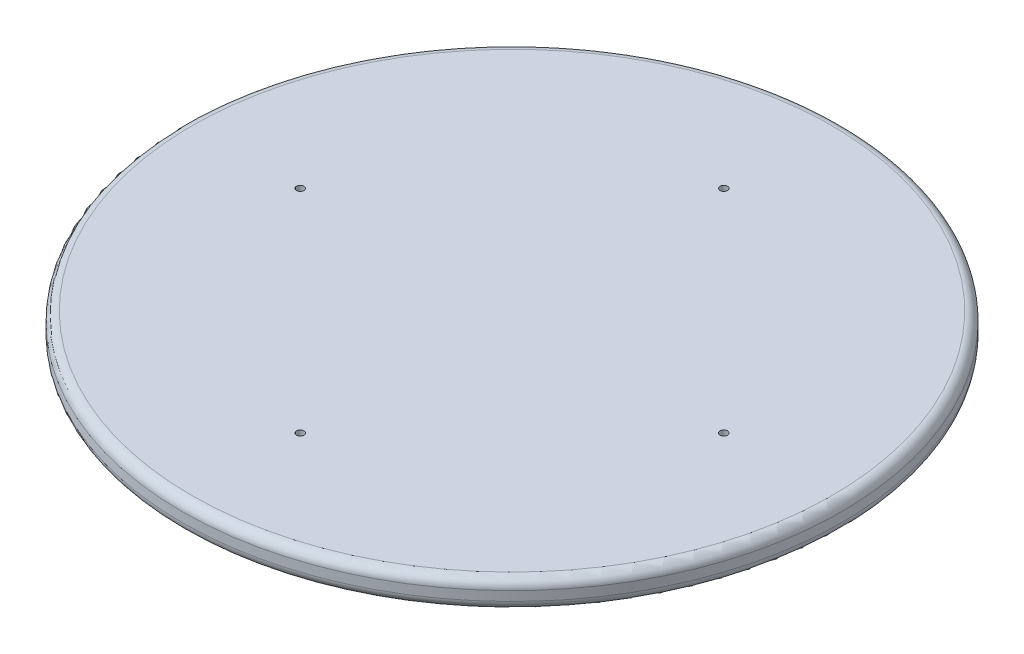
ISO-10303-21;
HEADER;
FILE_DESCRIPTION(('STEP AP214'),'2;1');
FILE_NAME('part.step','',(''),(''),'','','');
FILE_SCHEMA(('AUTOMOTIVE_DESIGN { 1 0 10303 214 1 1 1 1 }'));
ENDSEC;
DATA;
#1=APPLICATION_CONTEXT('core data for automotive mechanical design processes');
#2=APPLICATION_PROTOCOL_DEFINITION('international standard','automotive_design',2000,#1);
#3=PRODUCT_CONTEXT('',#1,'mechanical');
#4=PRODUCT('Part','Part','',(#3));
#5=PRODUCT_RELATED_PRODUCT_CATEGORY('part','',(#4));
#6=PRODUCT_DEFINITION_FORMATION('','',#4);
#7=PRODUCT_DEFINITION_CONTEXT('part definition',#1,'design');
#8=PRODUCT_DEFINITION('design','',#6,#7);
#9=PRODUCT_DEFINITION_SHAPE('','',#8);
#10=(LENGTH_UNIT() NAMED_UNIT(*) SI_UNIT(.MILLI.,.METRE.));
#11=(NAMED_UNIT(*) PLANE_ANGLE_UNIT() SI_UNIT($,.RADIAN.));
#12=(NAMED_UNIT(*) SI_UNIT($,.STERADIAN.) SOLID_ANGLE_UNIT());
#13=UNCERTAINTY_MEASURE_WITH_UNIT(LENGTH_MEASURE(1.E-05),#10,'distance_accuracy_value','');
#14=(GEOMETRIC_REPRESENTATION_CONTEXT(3) GLOBAL_UNCERTAINTY_ASSIGNED_CONTEXT((#13)) GLOBAL_UNIT_ASSIGNED_CONTEXT((#10,
#11,#12)) REPRESENTATION_CONTEXT('',''));
#15=CARTESIAN_POINT('',(0.,0.,0.));
#16=DIRECTION('',(0.,0.,1.));
#17=DIRECTION('',(1.,0.,0.));
#18=AXIS2_PLACEMENT_3D('',#15,#16,#17);
#19=CARTESIAN_POINT('',(0.,30.,0.));
#20=DIRECTION('',(0.,-1.,0.));
#21=DIRECTION('',(0.,0.,-1.));
#22=AXIS2_PLACEMENT_3D('',#19,#20,#21);
#23=CYLINDRICAL_SURFACE('',#22,350.);
#24=CARTESIAN_POINT('',(0.,10.,0.));
#25=DIRECTION('',(0.,1.,0.));
#26=DIRECTION('',(0.,0.,1.));
#27=AXIS2_PLACEMENT_3D('',#24,#25,#26);
#28=CIRCLE('',#27,350.);
#29=CARTESIAN_POINT('',(0.,10.,350.));
#30=VERTEX_POINT('',#29);
#31=EDGE_CURVE('E56',#30,#30,#28,.T.);
#32=ORIENTED_EDGE('',*,*,#31,.T.);
#33=EDGE_LOOP('',(#32));
#34=FACE_BOUND('',#33,.T.);
#35=CARTESIAN_POINT('',(0.,20.,0.));
#36=DIRECTION('',(0.,1.,0.));
#37=DIRECTION('',(0.,0.,1.));
#38=AXIS2_PLACEMENT_3D('',#35,#36,#37);
#39=CIRCLE('',#38,350.);
#40=CARTESIAN_POINT('',(0.,20.,350.));
#41=VERTEX_POINT('',#40);
#42=EDGE_CURVE('E83',#41,#41,#39,.F.);
#43=ORIENTED_EDGE('',*,*,#42,.T.);
#44=EDGE_LOOP('',(#43));
#45=FACE_BOUND('',#44,.T.);
#46=ADVANCED_FACE('F43',(#34,#45),#23,.T.);
#47=CARTESIAN_POINT('',(0.,30.,0.));
#48=DIRECTION('',(0.,1.,0.));
#49=DIRECTION('',(0.,0.,1.));
#50=AXIS2_PLACEMENT_3D('',#47,#48,#49);
#51=PLANE('',#50);
#52=CARTESIAN_POINT('',(0.,30.,-225.));
#53=DIRECTION('',(0.,1.,0.));
#54=DIRECTION('',(0.,0.,1.));
#55=AXIS2_PLACEMENT_3D('',#52,#53,#54);
#56=CIRCLE('',#55,4.);
#57=CARTESIAN_POINT('',(0.,30.,-221.));
#58=VERTEX_POINT('',#57);
#59=EDGE_CURVE('E80',#58,#58,#56,.T.);
#60=ORIENTED_EDGE('',*,*,#59,.F.);
#61=EDGE_LOOP('',(#60));
#62=FACE_BOUND('',#61,.T.);
#63=CARTESIAN_POINT('',(225.,30.,7.85583301239705E-13));
#64=DIRECTION('',(0.,1.,0.));
#65=DIRECTION('',(0.,0.,1.));
#66=AXIS2_PLACEMENT_3D('',#63,#64,#65);
#67=CIRCLE('',#66,4.00000000000001);
#68=CARTESIAN_POINT('',(225.,30.,4.00000000000079));
#69=VERTEX_POINT('',#68);
#70=EDGE_CURVE('E69',#69,#69,#67,.T.);
#71=ORIENTED_EDGE('',*,*,#70,.F.);
#72=EDGE_LOOP('',(#71));
#73=FACE_BOUND('',#72,.T.);
#74=CARTESIAN_POINT('',(-1.57116660247941E-12,30.,225.));
#75=DIRECTION('',(0.,1.,0.));
#76=DIRECTION('',(0.,0.,1.));
#77=AXIS2_PLACEMENT_3D('',#74,#75,#76);
#78=CIRCLE('',#77,4.);
#79=CARTESIAN_POINT('',(-1.57116660247941E-12,30.,229.));
#80=VERTEX_POINT('',#79);
#81=EDGE_CURVE('E66',#80,#80,#78,.T.);
#82=ORIENTED_EDGE('',*,*,#81,.F.);
#83=EDGE_LOOP('',(#82));
#84=FACE_BOUND('',#83,.T.);
#85=CARTESIAN_POINT('',(-225.,30.,-2.35674990371912E-12));
#86=DIRECTION('',(0.,1.,0.));
#87=DIRECTION('',(0.,0.,1.));
#88=AXIS2_PLACEMENT_3D('',#85,#86,#87);
#89=CIRCLE('',#88,4.00000000000001);
#90=CARTESIAN_POINT('',(-225.,30.,3.99999999999765));
#91=VERTEX_POINT('',#90);
#92=EDGE_CURVE('E63',#91,#91,#89,.T.);
#93=ORIENTED_EDGE('',*,*,#92,.F.);
#94=EDGE_LOOP('',(#93));
#95=FACE_BOUND('',#94,.T.);
#96=CARTESIAN_POINT('',(0.,30.,0.));
#97=DIRECTION('',(0.,1.,0.));
#98=DIRECTION('',(0.,0.,1.));
#99=AXIS2_PLACEMENT_3D('',#96,#97,#98);
#100=CIRCLE('',#99,340.);
#101=CARTESIAN_POINT('',(0.,30.,340.));
#102=VERTEX_POINT('',#101);
#103=EDGE_CURVE('E10',#102,#102,#100,.T.);
#104=ORIENTED_EDGE('',*,*,#103,.T.);
#105=EDGE_LOOP('',(#104));
#106=FACE_BOUND('',#105,.T.);
#107=ADVANCED_FACE('F101',(#62,#73,#84,#95,#106),#51,.T.);
#108=CARTESIAN_POINT('',(0.,0.,0.));
#109=DIRECTION('',(0.,1.,0.));
#110=DIRECTION('',(0.,0.,1.));
#111=AXIS2_PLACEMENT_3D('',#108,#109,#110);
#112=PLANE('',#111);
#113=CARTESIAN_POINT('',(0.,0.,-225.));
#114=DIRECTION('',(0.,1.,0.));
#115=DIRECTION('',(0.,0.,1.));
#116=AXIS2_PLACEMENT_3D('',#113,#114,#115);
#117=CIRCLE('',#116,4.);
#118=CARTESIAN_POINT('',(0.,0.,-221.));
#119=VERTEX_POINT('',#118);
#120=EDGE_CURVE('E47',#119,#119,#117,.T.);
#121=ORIENTED_EDGE('',*,*,#120,.T.);
#122=EDGE_LOOP('',(#121));
#123=FACE_BOUND('',#122,.T.);
#124=CARTESIAN_POINT('',(225.,0.,7.85583301239705E-13));
#125=DIRECTION('',(0.,1.,0.));
#126=DIRECTION('',(0.,0.,1.));
#127=AXIS2_PLACEMENT_3D('',#124,#125,#126);
#128=CIRCLE('',#127,4.00000000000001);
#129=CARTESIAN_POINT('',(225.,0.,4.00000000000079));
#130=VERTEX_POINT('',#129);
#131=EDGE_CURVE('E67',#130,#130,#128,.T.);
#132=ORIENTED_EDGE('',*,*,#131,.T.);
#133=EDGE_LOOP('',(#132));
#134=FACE_BOUND('',#133,.T.);
#135=CARTESIAN_POINT('',(-1.57116660247941E-12,0.,225.));
#136=DIRECTION('',(0.,1.,0.));
#137=DIRECTION('',(0.,0.,1.));
#138=AXIS2_PLACEMENT_3D('',#135,#136,#137);
#139=CIRCLE('',#138,4.);
#140=CARTESIAN_POINT('',(-1.57116660247941E-12,0.,229.));
#141=VERTEX_POINT('',#140);
#142=EDGE_CURVE('E64',#141,#141,#139,.T.);
#143=ORIENTED_EDGE('',*,*,#142,.T.);
#144=EDGE_LOOP('',(#143));
#145=FACE_BOUND('',#144,.T.);
#146=CARTESIAN_POINT('',(-225.,0.,-2.35674990371912E-12));
#147=DIRECTION('',(0.,1.,0.));
#148=DIRECTION('',(0.,0.,1.));
#149=AXIS2_PLACEMENT_3D('',#146,#147,#148);
#150=CIRCLE('',#149,4.00000000000001);
#151=CARTESIAN_POINT('',(-225.,0.,3.99999999999765));
#152=VERTEX_POINT('',#151);
#153=EDGE_CURVE('E60',#152,#152,#150,.T.);
#154=ORIENTED_EDGE('',*,*,#153,.T.);
#155=EDGE_LOOP('',(#154));
#156=FACE_BOUND('',#155,.T.);
#157=CARTESIAN_POINT('',(0.,0.,0.));
#158=DIRECTION('',(0.,1.,0.));
#159=DIRECTION('',(0.,0.,1.));
#160=AXIS2_PLACEMENT_3D('',#157,#158,#159);
#161=CIRCLE('',#160,340.);
#162=CARTESIAN_POINT('',(0.,0.,340.));
#163=VERTEX_POINT('',#162);
#164=EDGE_CURVE('E51',#163,#163,#161,.F.);
#165=ORIENTED_EDGE('',*,*,#164,.T.);
#166=EDGE_LOOP('',(#165));
#167=FACE_BOUND('',#166,.T.);
#168=ADVANCED_FACE('F92',(#123,#134,#145,#156,#167),#112,.F.);
#169=CARTESIAN_POINT('',(0.,10.,0.));
#170=DIRECTION('',(0.,1.,0.));
#171=DIRECTION('',(0.,0.,1.));
#172=AXIS2_PLACEMENT_3D('',#169,#170,#171);
#173=TOROIDAL_SURFACE('',#172,340.,10.);
#174=ORIENTED_EDGE('',*,*,#164,.F.);
#175=EDGE_LOOP('',(#174));
#176=FACE_BOUND('',#175,.T.);
#177=ORIENTED_EDGE('',*,*,#31,.F.);
#178=EDGE_LOOP('',(#177));
#179=FACE_BOUND('',#178,.T.);
#180=ADVANCED_FACE('F90',(#176,#179),#173,.T.);
#181=CARTESIAN_POINT('',(0.,20.,0.));
#182=DIRECTION('',(0.,1.,0.));
#183=DIRECTION('',(0.,0.,1.));
#184=AXIS2_PLACEMENT_3D('',#181,#182,#183);
#185=TOROIDAL_SURFACE('',#184,340.,10.);
#186=ORIENTED_EDGE('',*,*,#42,.F.);
#187=EDGE_LOOP('',(#186));
#188=FACE_BOUND('',#187,.T.);
#189=ORIENTED_EDGE('',*,*,#103,.F.);
#190=EDGE_LOOP('',(#189));
#191=FACE_BOUND('',#190,.T.);
#192=ADVANCED_FACE('F45',(#188,#191),#185,.T.);
#193=CARTESIAN_POINT('',(-225.,-18.,-2.35674990371912E-12));
#194=DIRECTION('',(0.,1.,0.));
#195=DIRECTION('',(0.,0.,1.));
#196=AXIS2_PLACEMENT_3D('',#193,#194,#195);
#197=CYLINDRICAL_SURFACE('',#196,4.00000000000001);
#198=ORIENTED_EDGE('',*,*,#92,.T.);
#199=EDGE_LOOP('',(#198));
#200=FACE_BOUND('',#199,.T.);
#201=ORIENTED_EDGE('',*,*,#153,.F.);
#202=EDGE_LOOP('',(#201));
#203=FACE_BOUND('',#202,.T.);
#204=ADVANCED_FACE('F98',(#200,#203),#197,.F.);
#205=CARTESIAN_POINT('',(-1.57116660247941E-12,-18.,225.));
#206=DIRECTION('',(0.,1.,0.));
#207=DIRECTION('',(0.,0.,1.));
#208=AXIS2_PLACEMENT_3D('',#205,#206,#207);
#209=CYLINDRICAL_SURFACE('',#208,4.);
#210=ORIENTED_EDGE('',*,*,#81,.T.);
#211=EDGE_LOOP('',(#210));
#212=FACE_BOUND('',#211,.T.);
#213=ORIENTED_EDGE('',*,*,#142,.F.);
#214=EDGE_LOOP('',(#213));
#215=FACE_BOUND('',#214,.T.);
#216=ADVANCED_FACE('F114',(#212,#215),#209,.F.);
#217=CARTESIAN_POINT('',(225.,-18.,7.85583301239705E-13));
#218=DIRECTION('',(0.,1.,0.));
#219=DIRECTION('',(0.,0.,1.));
#220=AXIS2_PLACEMENT_3D('',#217,#218,#219);
#221=CYLINDRICAL_SURFACE('',#220,4.00000000000001);
#222=ORIENTED_EDGE('',*,*,#70,.T.);
#223=EDGE_LOOP('',(#222));
#224=FACE_BOUND('',#223,.T.);
#225=ORIENTED_EDGE('',*,*,#131,.F.);
#226=EDGE_LOOP('',(#225));
#227=FACE_BOUND('',#226,.T.);
#228=ADVANCED_FACE('F118',(#224,#227),#221,.F.);
#229=CARTESIAN_POINT('',(0.,-18.,-225.));
#230=DIRECTION('',(0.,1.,0.));
#231=DIRECTION('',(0.,0.,1.));
#232=AXIS2_PLACEMENT_3D('',#229,#230,#231);
#233=CYLINDRICAL_SURFACE('',#232,4.);
#234=ORIENTED_EDGE('',*,*,#59,.T.);
#235=EDGE_LOOP('',(#234));
#236=FACE_BOUND('',#235,.T.);
#237=ORIENTED_EDGE('',*,*,#120,.F.);
#238=EDGE_LOOP('',(#237));
#239=FACE_BOUND('',#238,.T.);
#240=ADVANCED_FACE('F121',(#236,#239),#233,.F.);
#241=CLOSED_SHELL('',(#46,#107,#168,#180,#192,#204,#216,#228,#240));
#242=MANIFOLD_SOLID_BREP('B2',#241);
#243=ADVANCED_BREP_SHAPE_REPRESENTATION('',(#18,#242),#14);
#244=SHAPE_DEFINITION_REPRESENTATION(#9,#243);
ENDSEC;
END-ISO-10303-21;
